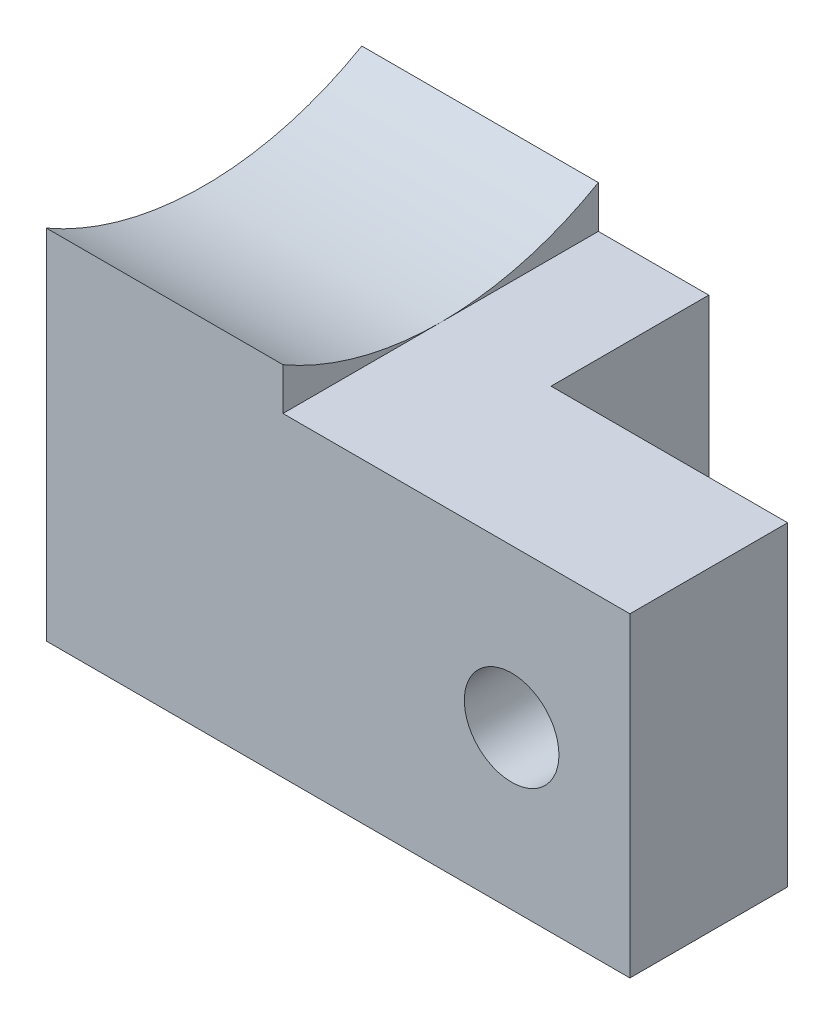
ISO-10303-21;
HEADER;
FILE_DESCRIPTION(('STEP AP214'),'2;1');
FILE_NAME('part.step','',(''),(''),'','','');
FILE_SCHEMA(('AUTOMOTIVE_DESIGN { 1 0 10303 214 1 1 1 1 }'));
ENDSEC;
DATA;
#1=APPLICATION_CONTEXT('core data for automotive mechanical design processes');
#2=APPLICATION_PROTOCOL_DEFINITION('international standard','automotive_design',2000,#1);
#3=PRODUCT_CONTEXT('',#1,'mechanical');
#4=PRODUCT('Part','Part','',(#3));
#5=PRODUCT_RELATED_PRODUCT_CATEGORY('part','',(#4));
#6=PRODUCT_DEFINITION_FORMATION('','',#4);
#7=PRODUCT_DEFINITION_CONTEXT('part definition',#1,'design');
#8=PRODUCT_DEFINITION('design','',#6,#7);
#9=PRODUCT_DEFINITION_SHAPE('','',#8);
#10=(LENGTH_UNIT() NAMED_UNIT(*) SI_UNIT(.MILLI.,.METRE.));
#11=(NAMED_UNIT(*) PLANE_ANGLE_UNIT() SI_UNIT($,.RADIAN.));
#12=(NAMED_UNIT(*) SI_UNIT($,.STERADIAN.) SOLID_ANGLE_UNIT());
#13=UNCERTAINTY_MEASURE_WITH_UNIT(LENGTH_MEASURE(1.E-05),#10,'distance_accuracy_value','');
#14=(GEOMETRIC_REPRESENTATION_CONTEXT(3) GLOBAL_UNCERTAINTY_ASSIGNED_CONTEXT((#13)) GLOBAL_UNIT_ASSIGNED_CONTEXT((#10,
#11,#12)) REPRESENTATION_CONTEXT('',''));
#15=CARTESIAN_POINT('',(0.,0.,0.));
#16=DIRECTION('',(0.,0.,1.));
#17=DIRECTION('',(1.,0.,0.));
#18=AXIS2_PLACEMENT_3D('',#15,#16,#17);
#19=CARTESIAN_POINT('',(14.9999999999999,20.,-20.));
#20=DIRECTION('',(1.,0.,0.));
#21=DIRECTION('',(0.,0.,1.));
#22=AXIS2_PLACEMENT_3D('',#19,#20,#21);
#23=PLANE('',#22);
#24=CARTESIAN_POINT('',(14.9999999999998,37.3205080780118,-10.));
#25=DIRECTION('',(1.,0.,0.));
#26=DIRECTION('',(0.,0.,1.));
#27=AXIS2_PLACEMENT_3D('',#24,#25,#26);
#28=CIRCLE('',#27,20.0000000020118);
#29=CARTESIAN_POINT('',(14.9999999999999,20.,0.));
#30=VERTEX_POINT('',#29);
#31=CARTESIAN_POINT('',(14.9999999999999,17.320508076,-10.));
#32=VERTEX_POINT('',#31);
#33=EDGE_CURVE('E101',#30,#32,#28,.T.);
#34=ORIENTED_EDGE('',*,*,#33,.F.);
#35=DIRECTION('',(0.,-1.,0.));
#36=VECTOR('',#35,1.);
#37=CARTESIAN_POINT('',(14.9999999999999,20.,0.));
#38=LINE('',#37,#36);
#39=CARTESIAN_POINT('',(14.9999999999999,17.320508076,0.));
#40=VERTEX_POINT('',#39);
#41=EDGE_CURVE('E120',#30,#40,#38,.T.);
#42=ORIENTED_EDGE('',*,*,#41,.T.);
#43=DIRECTION('',(0.,0.,1.));
#44=VECTOR('',#43,1.);
#45=CARTESIAN_POINT('',(14.9999999999999,17.320508076,-20.));
#46=LINE('',#45,#44);
#47=EDGE_CURVE('E52',#32,#40,#46,.T.);
#48=ORIENTED_EDGE('',*,*,#47,.F.);
#49=EDGE_LOOP('',(#34,#42,#48));
#50=FACE_BOUND('',#49,.T.);
#51=ADVANCED_FACE('F34',(#50),#23,.T.);
#52=CARTESIAN_POINT('',(36.9999999999999,17.3205080760001,0.));
#53=DIRECTION('',(0.,1.,0.));
#54=DIRECTION('',(0.,0.,-1.));
#55=AXIS2_PLACEMENT_3D('',#52,#53,#54);
#56=PLANE('',#55);
#57=DIRECTION('',(0.,0.,1.));
#58=VECTOR('',#57,1.);
#59=CARTESIAN_POINT('',(14.9999999999999,17.320508076,-20.));
#60=LINE('',#59,#58);
#61=CARTESIAN_POINT('',(14.9999999999999,17.320508076,-20.));
#62=VERTEX_POINT('',#61);
#63=EDGE_CURVE('E115',#62,#32,#60,.T.);
#64=ORIENTED_EDGE('',*,*,#63,.T.);
#65=ORIENTED_EDGE('',*,*,#47,.T.);
#66=DIRECTION('',(-1.,0.,0.));
#67=VECTOR('',#66,1.);
#68=CARTESIAN_POINT('',(36.9999999999999,17.3205080760001,0.));
#69=LINE('',#68,#67);
#70=CARTESIAN_POINT('',(36.9999999999999,17.3205080760001,0.));
#71=VERTEX_POINT('',#70);
#72=EDGE_CURVE('E132',#71,#40,#69,.T.);
#73=ORIENTED_EDGE('',*,*,#72,.F.);
#74=DIRECTION('',(0.,0.,1.));
#75=VECTOR('',#74,1.);
#76=CARTESIAN_POINT('',(36.9999999999999,17.3205080760001,0.));
#77=LINE('',#76,#75);
#78=CARTESIAN_POINT('',(36.9999999999999,17.3205080760001,-10.));
#79=VERTEX_POINT('',#78);
#80=EDGE_CURVE('E130',#79,#71,#77,.T.);
#81=ORIENTED_EDGE('',*,*,#80,.F.);
#82=DIRECTION('',(1.,0.,0.));
#83=VECTOR('',#82,1.);
#84=CARTESIAN_POINT('',(36.9999999999999,17.3205080760001,-10.));
#85=LINE('',#84,#83);
#86=CARTESIAN_POINT('',(21.9999999999999,17.320508076,-10.));
#87=VERTEX_POINT('',#86);
#88=EDGE_CURVE('E44',#87,#79,#85,.T.);
#89=ORIENTED_EDGE('',*,*,#88,.F.);
#90=DIRECTION('',(0.,0.,-1.));
#91=VECTOR('',#90,1.);
#92=CARTESIAN_POINT('',(21.9999999999999,17.320508076,0.));
#93=LINE('',#92,#91);
#94=CARTESIAN_POINT('',(21.9999999999999,17.320508076,-20.));
#95=VERTEX_POINT('',#94);
#96=EDGE_CURVE('E12',#87,#95,#93,.T.);
#97=ORIENTED_EDGE('',*,*,#96,.T.);
#98=DIRECTION('',(1.,0.,0.));
#99=VECTOR('',#98,1.);
#100=CARTESIAN_POINT('',(36.9999999999999,17.3205080760001,-20.));
#101=LINE('',#100,#99);
#102=EDGE_CURVE('E124',#62,#95,#101,.T.);
#103=ORIENTED_EDGE('',*,*,#102,.F.);
#104=EDGE_LOOP('',(#64,#65,#73,#81,#89,#97,#103));
#105=FACE_BOUND('',#104,.T.);
#106=ADVANCED_FACE('F123',(#105),#56,.T.);
#107=CARTESIAN_POINT('',(37.0000000000001,-2.67949192399988,-20.));
#108=DIRECTION('',(0.,0.,1.));
#109=DIRECTION('',(-1.,0.,0.));
#110=AXIS2_PLACEMENT_3D('',#107,#108,#109);
#111=PLANE('',#110);
#112=DIRECTION('',(0.,-1.,0.));
#113=VECTOR('',#112,1.);
#114=CARTESIAN_POINT('',(21.9999999999999,17.320520076,-20.));
#115=LINE('',#114,#113);
#116=CARTESIAN_POINT('',(22.0000000000001,-2.67949192399998,-20.));
#117=VERTEX_POINT('',#116);
#118=EDGE_CURVE('E133',#95,#117,#115,.T.);
#119=ORIENTED_EDGE('',*,*,#118,.T.);
#120=DIRECTION('',(1.,0.,0.));
#121=VECTOR('',#120,1.);
#122=CARTESIAN_POINT('',(37.0000000000001,-2.67949192399988,-20.));
#123=LINE('',#122,#121);
#124=CARTESIAN_POINT('',(0.,-2.67949192400013,-20.));
#125=VERTEX_POINT('',#124);
#126=EDGE_CURVE('E155',#125,#117,#123,.T.);
#127=ORIENTED_EDGE('',*,*,#126,.F.);
#128=DIRECTION('',(0.,1.,0.));
#129=VECTOR('',#128,1.);
#130=CARTESIAN_POINT('',(0.,-2.67949192400013,-20.));
#131=LINE('',#130,#129);
#132=CARTESIAN_POINT('',(0.,19.9999999999999,-20.));
#133=VERTEX_POINT('',#132);
#134=EDGE_CURVE('E158',#125,#133,#131,.T.);
#135=ORIENTED_EDGE('',*,*,#134,.T.);
#136=DIRECTION('',(1.,0.,0.));
#137=VECTOR('',#136,1.);
#138=CARTESIAN_POINT('',(0.,19.9999999999999,-20.));
#139=LINE('',#138,#137);
#140=CARTESIAN_POINT('',(14.9999999999999,20.,-20.));
#141=VERTEX_POINT('',#140);
#142=EDGE_CURVE('E125',#133,#141,#139,.T.);
#143=ORIENTED_EDGE('',*,*,#142,.T.);
#144=DIRECTION('',(0.,-1.,0.));
#145=VECTOR('',#144,1.);
#146=CARTESIAN_POINT('',(14.9999999999999,20.,-20.));
#147=LINE('',#146,#145);
#148=EDGE_CURVE('E117',#141,#62,#147,.T.);
#149=ORIENTED_EDGE('',*,*,#148,.T.);
#150=ORIENTED_EDGE('',*,*,#102,.T.);
#151=EDGE_LOOP('',(#119,#127,#135,#143,#149,#150));
#152=FACE_BOUND('',#151,.T.);
#153=ADVANCED_FACE('F190',(#152),#111,.F.);
#154=CARTESIAN_POINT('',(37.0000000000001,-2.67949192399988,0.));
#155=DIRECTION('',(0.,1.,0.));
#156=DIRECTION('',(0.,0.,-1.));
#157=AXIS2_PLACEMENT_3D('',#154,#155,#156);
#158=PLANE('',#157);
#159=DIRECTION('',(0.,0.,1.));
#160=VECTOR('',#159,1.);
#161=CARTESIAN_POINT('',(22.0000000000001,-2.67949192399998,-20.));
#162=LINE('',#161,#160);
#163=CARTESIAN_POINT('',(22.0000000000001,-2.67949192399998,-10.));
#164=VERTEX_POINT('',#163);
#165=EDGE_CURVE('E143',#117,#164,#162,.T.);
#166=ORIENTED_EDGE('',*,*,#165,.T.);
#167=DIRECTION('',(-1.,0.,0.));
#168=VECTOR('',#167,1.);
#169=CARTESIAN_POINT('',(37.0000000000001,-2.67949192399988,-10.));
#170=LINE('',#169,#168);
#171=CARTESIAN_POINT('',(37.0000000000001,-2.67949192399988,-10.));
#172=VERTEX_POINT('',#171);
#173=EDGE_CURVE('E147',#172,#164,#170,.T.);
#174=ORIENTED_EDGE('',*,*,#173,.F.);
#175=DIRECTION('',(0.,0.,1.));
#176=VECTOR('',#175,1.);
#177=CARTESIAN_POINT('',(37.0000000000001,-2.67949192399988,0.));
#178=LINE('',#177,#176);
#179=CARTESIAN_POINT('',(37.0000000000001,-2.67949192399988,0.));
#180=VERTEX_POINT('',#179);
#181=EDGE_CURVE('E137',#172,#180,#178,.T.);
#182=ORIENTED_EDGE('',*,*,#181,.T.);
#183=DIRECTION('',(-1.,0.,0.));
#184=VECTOR('',#183,1.);
#185=CARTESIAN_POINT('',(37.0000000000001,-2.67949192399988,0.));
#186=LINE('',#185,#184);
#187=CARTESIAN_POINT('',(0.,-2.67949192400013,0.));
#188=VERTEX_POINT('',#187);
#189=EDGE_CURVE('E139',#180,#188,#186,.T.);
#190=ORIENTED_EDGE('',*,*,#189,.T.);
#191=DIRECTION('',(0.,0.,-1.));
#192=VECTOR('',#191,1.);
#193=CARTESIAN_POINT('',(0.,-2.67949192400013,0.));
#194=LINE('',#193,#192);
#195=EDGE_CURVE('E159',#188,#125,#194,.T.);
#196=ORIENTED_EDGE('',*,*,#195,.T.);
#197=ORIENTED_EDGE('',*,*,#126,.T.);
#198=EDGE_LOOP('',(#166,#174,#182,#190,#196,#197));
#199=FACE_BOUND('',#198,.T.);
#200=ADVANCED_FACE('F36',(#199),#158,.F.);
#201=CARTESIAN_POINT('',(37.0000000000001,-2.67949192399988,0.));
#202=DIRECTION('',(-1.,0.,0.));
#203=DIRECTION('',(0.,0.,-1.));
#204=AXIS2_PLACEMENT_3D('',#201,#202,#203);
#205=PLANE('',#204);
#206=ORIENTED_EDGE('',*,*,#181,.F.);
#207=DIRECTION('',(0.,-1.,0.));
#208=VECTOR('',#207,1.);
#209=CARTESIAN_POINT('',(36.9999999999999,17.3205200760001,-10.));
#210=LINE('',#209,#208);
#211=EDGE_CURVE('E140',#79,#172,#210,.T.);
#212=ORIENTED_EDGE('',*,*,#211,.F.);
#213=ORIENTED_EDGE('',*,*,#80,.T.);
#214=DIRECTION('',(0.,1.,0.));
#215=VECTOR('',#214,1.);
#216=CARTESIAN_POINT('',(37.0000000000001,-2.67949192399988,0.));
#217=LINE('',#216,#215);
#218=EDGE_CURVE('E134',#180,#71,#217,.T.);
#219=ORIENTED_EDGE('',*,*,#218,.F.);
#220=EDGE_LOOP('',(#206,#212,#213,#219));
#221=FACE_BOUND('',#220,.T.);
#222=ADVANCED_FACE('F179',(#221),#205,.F.);
#223=CARTESIAN_POINT('',(0.,20.,0.));
#224=DIRECTION('',(0.,0.,-1.));
#225=DIRECTION('',(-1.,0.,0.));
#226=AXIS2_PLACEMENT_3D('',#223,#224,#225);
#227=PLANE('',#226);
#228=CARTESIAN_POINT('',(29.5,7.32050807600007,0.));
#229=DIRECTION('',(0.,0.,-1.));
#230=DIRECTION('',(1.,0.,0.));
#231=AXIS2_PLACEMENT_3D('',#228,#229,#230);
#232=CIRCLE('',#231,3.);
#233=CARTESIAN_POINT('',(32.5,7.32050807600009,0.));
#234=VERTEX_POINT('',#233);
#235=EDGE_CURVE('E38',#234,#234,#232,.T.);
#236=ORIENTED_EDGE('',*,*,#235,.T.);
#237=EDGE_LOOP('',(#236));
#238=FACE_BOUND('',#237,.T.);
#239=ORIENTED_EDGE('',*,*,#72,.T.);
#240=ORIENTED_EDGE('',*,*,#41,.F.);
#241=DIRECTION('',(1.,0.,0.));
#242=VECTOR('',#241,1.);
#243=CARTESIAN_POINT('',(0.,19.9999999999999,0.));
#244=LINE('',#243,#242);
#245=CARTESIAN_POINT('',(0.,19.9999999999999,0.));
#246=VERTEX_POINT('',#245);
#247=EDGE_CURVE('E107',#246,#30,#244,.T.);
#248=ORIENTED_EDGE('',*,*,#247,.F.);
#249=DIRECTION('',(0.,1.,0.));
#250=VECTOR('',#249,1.);
#251=CARTESIAN_POINT('',(0.,-2.67949192400013,0.));
#252=LINE('',#251,#250);
#253=EDGE_CURVE('E162',#188,#246,#252,.T.);
#254=ORIENTED_EDGE('',*,*,#253,.F.);
#255=ORIENTED_EDGE('',*,*,#189,.F.);
#256=ORIENTED_EDGE('',*,*,#218,.T.);
#257=EDGE_LOOP('',(#239,#240,#248,#254,#255,#256));
#258=FACE_BOUND('',#257,.T.);
#259=ADVANCED_FACE('F171',(#238,#258),#227,.F.);
#260=CARTESIAN_POINT('',(0.,-2.67949192400013,0.));
#261=DIRECTION('',(1.,0.,0.));
#262=DIRECTION('',(0.,0.,1.));
#263=AXIS2_PLACEMENT_3D('',#260,#261,#262);
#264=PLANE('',#263);
#265=ORIENTED_EDGE('',*,*,#253,.T.);
#266=CARTESIAN_POINT('',(-2.0122792321331E-13,37.3205080780117,-10.));
#267=DIRECTION('',(1.,0.,0.));
#268=DIRECTION('',(0.,0.,1.));
#269=AXIS2_PLACEMENT_3D('',#266,#267,#268);
#270=CIRCLE('',#269,20.0000000020118);
#271=EDGE_CURVE('E110',#246,#133,#270,.T.);
#272=ORIENTED_EDGE('',*,*,#271,.T.);
#273=ORIENTED_EDGE('',*,*,#134,.F.);
#274=ORIENTED_EDGE('',*,*,#195,.F.);
#275=EDGE_LOOP('',(#265,#272,#273,#274));
#276=FACE_BOUND('',#275,.T.);
#277=ADVANCED_FACE('F194',(#276),#264,.F.);
#278=CARTESIAN_POINT('',(21.9999999999999,17.320520076,-20.));
#279=DIRECTION('',(1.,0.,0.));
#280=DIRECTION('',(0.,0.,1.));
#281=AXIS2_PLACEMENT_3D('',#278,#279,#280);
#282=PLANE('',#281);
#283=DIRECTION('',(0.,-1.,0.));
#284=VECTOR('',#283,1.);
#285=CARTESIAN_POINT('',(21.9999999999999,17.320520076,-10.));
#286=LINE('',#285,#284);
#287=EDGE_CURVE('E142',#87,#164,#286,.T.);
#288=ORIENTED_EDGE('',*,*,#287,.T.);
#289=ORIENTED_EDGE('',*,*,#165,.F.);
#290=ORIENTED_EDGE('',*,*,#118,.F.);
#291=ORIENTED_EDGE('',*,*,#96,.F.);
#292=EDGE_LOOP('',(#288,#289,#290,#291));
#293=FACE_BOUND('',#292,.T.);
#294=ADVANCED_FACE('F187',(#293),#282,.T.);
#295=CARTESIAN_POINT('',(36.9999999999999,17.3205200760001,-10.));
#296=DIRECTION('',(0.,0.,1.));
#297=DIRECTION('',(-1.,0.,0.));
#298=AXIS2_PLACEMENT_3D('',#295,#296,#297);
#299=PLANE('',#298);
#300=CARTESIAN_POINT('',(29.5,7.32050807600007,-10.));
#301=DIRECTION('',(0.,0.,-1.));
#302=DIRECTION('',(1.,0.,0.));
#303=AXIS2_PLACEMENT_3D('',#300,#301,#302);
#304=CIRCLE('',#303,3.);
#305=CARTESIAN_POINT('',(32.5,7.32050807600009,-10.));
#306=VERTEX_POINT('',#305);
#307=EDGE_CURVE('E144',#306,#306,#304,.T.);
#308=ORIENTED_EDGE('',*,*,#307,.F.);
#309=EDGE_LOOP('',(#308));
#310=FACE_BOUND('',#309,.T.);
#311=ORIENTED_EDGE('',*,*,#88,.T.);
#312=ORIENTED_EDGE('',*,*,#211,.T.);
#313=ORIENTED_EDGE('',*,*,#173,.T.);
#314=ORIENTED_EDGE('',*,*,#287,.F.);
#315=EDGE_LOOP('',(#311,#312,#313,#314));
#316=FACE_BOUND('',#315,.T.);
#317=ADVANCED_FACE('F182',(#310,#316),#299,.F.);
#318=CARTESIAN_POINT('',(29.5,7.32050807600007,0.));
#319=DIRECTION('',(0.,0.,-1.));
#320=DIRECTION('',(1.,0.,0.));
#321=AXIS2_PLACEMENT_3D('',#318,#319,#320);
#322=CYLINDRICAL_SURFACE('',#321,3.);
#323=ORIENTED_EDGE('',*,*,#235,.F.);
#324=EDGE_LOOP('',(#323));
#325=FACE_BOUND('',#324,.T.);
#326=ORIENTED_EDGE('',*,*,#307,.T.);
#327=EDGE_LOOP('',(#326));
#328=FACE_BOUND('',#327,.T.);
#329=ADVANCED_FACE('F216',(#325,#328),#322,.F.);
#330=CARTESIAN_POINT('',(14.9999999999998,37.3205080780118,-10.));
#331=DIRECTION('',(1.,0.,0.));
#332=DIRECTION('',(0.,0.,1.));
#333=AXIS2_PLACEMENT_3D('',#330,#331,#332);
#334=CIRCLE('',#333,20.0000000020118);
#335=EDGE_CURVE('E104',#32,#141,#334,.T.);
#336=ORIENTED_EDGE('',*,*,#335,.F.);
#337=ORIENTED_EDGE('',*,*,#63,.F.);
#338=ORIENTED_EDGE('',*,*,#148,.F.);
#339=EDGE_LOOP('',(#336,#337,#338));
#340=FACE_BOUND('',#339,.T.);
#341=ADVANCED_FACE('F114',(#340),#23,.T.);
#342=CARTESIAN_POINT('',(74.7306369505367,37.3205080780122,-10.));
#343=DIRECTION('',(-1.,0.,0.));
#344=DIRECTION('',(0.,0.,-1.));
#345=AXIS2_PLACEMENT_3D('',#342,#343,#344);
#346=CYLINDRICAL_SURFACE('',#345,20.0000000020118);
#347=ORIENTED_EDGE('',*,*,#271,.F.);
#348=ORIENTED_EDGE('',*,*,#247,.T.);
#349=ORIENTED_EDGE('',*,*,#33,.T.);
#350=ORIENTED_EDGE('',*,*,#335,.T.);
#351=ORIENTED_EDGE('',*,*,#142,.F.);
#352=EDGE_LOOP('',(#347,#348,#349,#350,#351));
#353=FACE_BOUND('',#352,.T.);
#354=ADVANCED_FACE('F103',(#353),#346,.F.);
#355=CLOSED_SHELL('',(#51,#106,#153,#200,#222,#259,#277,#294,#317,#329,#341,#354));
#356=MANIFOLD_SOLID_BREP('B2',#355);
#357=ADVANCED_BREP_SHAPE_REPRESENTATION('',(#18,#356),#14);
#358=SHAPE_DEFINITION_REPRESENTATION(#9,#357);
ENDSEC;
END-ISO-10303-21;
